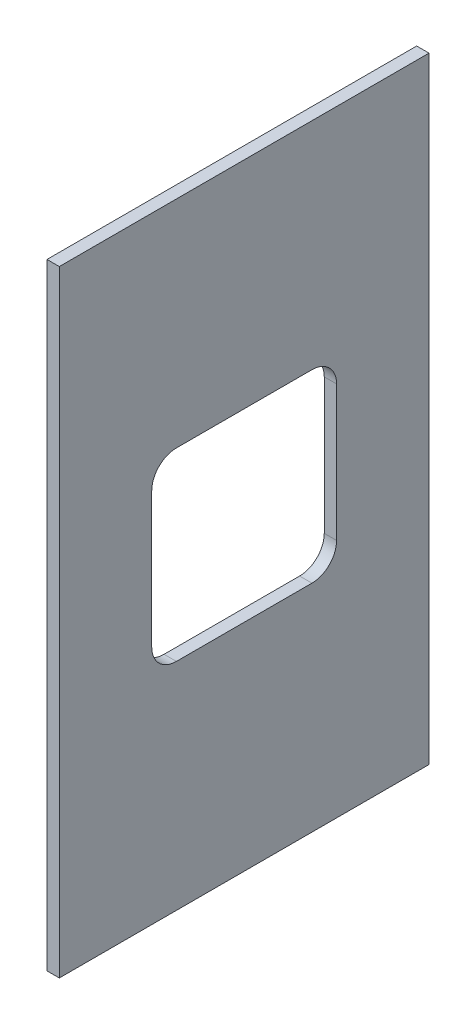
ISO-10303-21;
HEADER;
FILE_DESCRIPTION(('STEP AP214'),'2;1');
FILE_NAME('part.step','',(''),(''),'','','');
FILE_SCHEMA(('AUTOMOTIVE_DESIGN { 1 0 10303 214 1 1 1 1 }'));
ENDSEC;
DATA;
#1=APPLICATION_CONTEXT('core data for automotive mechanical design processes');
#2=APPLICATION_PROTOCOL_DEFINITION('international standard','automotive_design',2000,#1);
#3=PRODUCT_CONTEXT('',#1,'mechanical');
#4=PRODUCT('Part','Part','',(#3));
#5=PRODUCT_RELATED_PRODUCT_CATEGORY('part','',(#4));
#6=PRODUCT_DEFINITION_FORMATION('','',#4);
#7=PRODUCT_DEFINITION_CONTEXT('part definition',#1,'design');
#8=PRODUCT_DEFINITION('design','',#6,#7);
#9=PRODUCT_DEFINITION_SHAPE('','',#8);
#10=(LENGTH_UNIT() NAMED_UNIT(*) SI_UNIT(.MILLI.,.METRE.));
#11=(NAMED_UNIT(*) PLANE_ANGLE_UNIT() SI_UNIT($,.RADIAN.));
#12=(NAMED_UNIT(*) SI_UNIT($,.STERADIAN.) SOLID_ANGLE_UNIT());
#13=UNCERTAINTY_MEASURE_WITH_UNIT(LENGTH_MEASURE(1.E-05),#10,'distance_accuracy_value','');
#14=(GEOMETRIC_REPRESENTATION_CONTEXT(3) GLOBAL_UNCERTAINTY_ASSIGNED_CONTEXT((#13)) GLOBAL_UNIT_ASSIGNED_CONTEXT((#10,
#11,#12)) REPRESENTATION_CONTEXT('',''));
#15=CARTESIAN_POINT('',(0.,0.,0.));
#16=DIRECTION('',(0.,0.,1.));
#17=DIRECTION('',(1.,0.,0.));
#18=AXIS2_PLACEMENT_3D('',#15,#16,#17);
#19=CARTESIAN_POINT('',(10.,0.,0.));
#20=DIRECTION('',(-1.,0.,0.));
#21=DIRECTION('',(0.,0.,1.));
#22=AXIS2_PLACEMENT_3D('',#19,#20,#21);
#23=PLANE('',#22);
#24=DIRECTION('',(0.,0.,-1.));
#25=VECTOR('',#24,1.);
#26=CARTESIAN_POINT('',(10.,0.,0.));
#27=LINE('',#26,#25);
#28=CARTESIAN_POINT('',(10.,0.,300.));
#29=VERTEX_POINT('',#28);
#30=CARTESIAN_POINT('',(10.,0.,0.));
#31=VERTEX_POINT('',#30);
#32=EDGE_CURVE('E178',#29,#31,#27,.T.);
#33=ORIENTED_EDGE('',*,*,#32,.T.);
#34=DIRECTION('',(0.,1.,0.));
#35=VECTOR('',#34,1.);
#36=CARTESIAN_POINT('',(10.,0.,0.));
#37=LINE('',#36,#35);
#38=CARTESIAN_POINT('',(10.,500.,0.));
#39=VERTEX_POINT('',#38);
#40=EDGE_CURVE('E183',#31,#39,#37,.T.);
#41=ORIENTED_EDGE('',*,*,#40,.T.);
#42=DIRECTION('',(0.,0.,1.));
#43=VECTOR('',#42,1.);
#44=CARTESIAN_POINT('',(10.,500.,0.));
#45=LINE('',#44,#43);
#46=CARTESIAN_POINT('',(10.,500.,300.));
#47=VERTEX_POINT('',#46);
#48=EDGE_CURVE('E187',#39,#47,#45,.T.);
#49=ORIENTED_EDGE('',*,*,#48,.T.);
#50=DIRECTION('',(0.,-1.,0.));
#51=VECTOR('',#50,1.);
#52=CARTESIAN_POINT('',(10.,0.,300.));
#53=LINE('',#52,#51);
#54=EDGE_CURVE('E191',#47,#29,#53,.T.);
#55=ORIENTED_EDGE('',*,*,#54,.T.);
#56=EDGE_LOOP('',(#33,#41,#49,#55));
#57=FACE_BOUND('',#56,.T.);
#58=CARTESIAN_POINT('',(10.,305.,95.));
#59=DIRECTION('',(1.,0.,0.));
#60=DIRECTION('',(0.,0.,-1.));
#61=AXIS2_PLACEMENT_3D('',#58,#59,#60);
#62=CIRCLE('',#61,20.);
#63=CARTESIAN_POINT('',(10.,305.,75.));
#64=VERTEX_POINT('',#63);
#65=CARTESIAN_POINT('',(10.,325.,95.0000000000002));
#66=VERTEX_POINT('',#65);
#67=EDGE_CURVE('E138',#64,#66,#62,.T.);
#68=ORIENTED_EDGE('',*,*,#67,.F.);
#69=DIRECTION('',(0.,1.,0.));
#70=VECTOR('',#69,1.);
#71=CARTESIAN_POINT('',(10.,195.,75.));
#72=LINE('',#71,#70);
#73=CARTESIAN_POINT('',(10.,195.,75.));
#74=VERTEX_POINT('',#73);
#75=EDGE_CURVE('E311',#74,#64,#72,.T.);
#76=ORIENTED_EDGE('',*,*,#75,.F.);
#77=CARTESIAN_POINT('',(10.,195.,95.));
#78=DIRECTION('',(1.,0.,0.));
#79=DIRECTION('',(0.,0.,1.));
#80=AXIS2_PLACEMENT_3D('',#77,#78,#79);
#81=CIRCLE('',#80,20.);
#82=CARTESIAN_POINT('',(10.,175.,95.0000000000002));
#83=VERTEX_POINT('',#82);
#84=EDGE_CURVE('E351',#83,#74,#81,.T.);
#85=ORIENTED_EDGE('',*,*,#84,.F.);
#86=DIRECTION('',(0.,0.,-1.));
#87=VECTOR('',#86,1.);
#88=CARTESIAN_POINT('',(10.,175.,95.0000000000002));
#89=LINE('',#88,#87);
#90=CARTESIAN_POINT('',(10.,175.,205.));
#91=VERTEX_POINT('',#90);
#92=EDGE_CURVE('E349',#91,#83,#89,.T.);
#93=ORIENTED_EDGE('',*,*,#92,.F.);
#94=CARTESIAN_POINT('',(10.,195.,205.));
#95=DIRECTION('',(1.,0.,0.));
#96=DIRECTION('',(0.,0.,1.));
#97=AXIS2_PLACEMENT_3D('',#94,#95,#96);
#98=CIRCLE('',#97,20.);
#99=CARTESIAN_POINT('',(10.,195.,225.));
#100=VERTEX_POINT('',#99);
#101=EDGE_CURVE('E347',#100,#91,#98,.T.);
#102=ORIENTED_EDGE('',*,*,#101,.F.);
#103=DIRECTION('',(0.,-1.,0.));
#104=VECTOR('',#103,1.);
#105=CARTESIAN_POINT('',(10.,195.,225.));
#106=LINE('',#105,#104);
#107=CARTESIAN_POINT('',(10.,305.,225.));
#108=VERTEX_POINT('',#107);
#109=EDGE_CURVE('E165',#108,#100,#106,.T.);
#110=ORIENTED_EDGE('',*,*,#109,.F.);
#111=CARTESIAN_POINT('',(10.,305.,205.));
#112=DIRECTION('',(1.,0.,0.));
#113=DIRECTION('',(0.,0.,1.));
#114=AXIS2_PLACEMENT_3D('',#111,#112,#113);
#115=CIRCLE('',#114,20.);
#116=CARTESIAN_POINT('',(10.,325.,205.));
#117=VERTEX_POINT('',#116);
#118=EDGE_CURVE('E161',#117,#108,#115,.T.);
#119=ORIENTED_EDGE('',*,*,#118,.F.);
#120=DIRECTION('',(0.,0.,1.));
#121=VECTOR('',#120,1.);
#122=CARTESIAN_POINT('',(10.,325.,95.0000000000002));
#123=LINE('',#122,#121);
#124=EDGE_CURVE('E147',#66,#117,#123,.T.);
#125=ORIENTED_EDGE('',*,*,#124,.F.);
#126=EDGE_LOOP('',(#68,#76,#85,#93,#102,#110,#119,#125));
#127=FACE_BOUND('',#126,.T.);
#128=ADVANCED_FACE('F48',(#57,#127),#23,.F.);
#129=CARTESIAN_POINT('',(0.,0.,0.));
#130=DIRECTION('',(-1.,0.,0.));
#131=DIRECTION('',(0.,0.,1.));
#132=AXIS2_PLACEMENT_3D('',#129,#130,#131);
#133=PLANE('',#132);
#134=DIRECTION('',(0.,0.,-1.));
#135=VECTOR('',#134,1.);
#136=CARTESIAN_POINT('',(0.,0.,0.));
#137=LINE('',#136,#135);
#138=CARTESIAN_POINT('',(0.,0.,300.));
#139=VERTEX_POINT('',#138);
#140=CARTESIAN_POINT('',(0.,0.,0.));
#141=VERTEX_POINT('',#140);
#142=EDGE_CURVE('E156',#139,#141,#137,.T.);
#143=ORIENTED_EDGE('',*,*,#142,.F.);
#144=DIRECTION('',(0.,-1.,0.));
#145=VECTOR('',#144,1.);
#146=CARTESIAN_POINT('',(0.,0.,300.));
#147=LINE('',#146,#145);
#148=CARTESIAN_POINT('',(0.,500.,300.));
#149=VERTEX_POINT('',#148);
#150=EDGE_CURVE('E184',#149,#139,#147,.T.);
#151=ORIENTED_EDGE('',*,*,#150,.F.);
#152=DIRECTION('',(0.,0.,1.));
#153=VECTOR('',#152,1.);
#154=CARTESIAN_POINT('',(0.,500.,0.));
#155=LINE('',#154,#153);
#156=CARTESIAN_POINT('',(0.,500.,0.));
#157=VERTEX_POINT('',#156);
#158=EDGE_CURVE('E206',#157,#149,#155,.T.);
#159=ORIENTED_EDGE('',*,*,#158,.F.);
#160=DIRECTION('',(0.,1.,0.));
#161=VECTOR('',#160,1.);
#162=CARTESIAN_POINT('',(0.,0.,0.));
#163=LINE('',#162,#161);
#164=EDGE_CURVE('E229',#141,#157,#163,.T.);
#165=ORIENTED_EDGE('',*,*,#164,.F.);
#166=EDGE_LOOP('',(#143,#151,#159,#165));
#167=FACE_BOUND('',#166,.T.);
#168=DIRECTION('',(0.,1.,0.));
#169=VECTOR('',#168,1.);
#170=CARTESIAN_POINT('',(0.,195.,75.));
#171=LINE('',#170,#169);
#172=CARTESIAN_POINT('',(0.,195.,75.));
#173=VERTEX_POINT('',#172);
#174=CARTESIAN_POINT('',(0.,305.,75.));
#175=VERTEX_POINT('',#174);
#176=EDGE_CURVE('E148',#173,#175,#171,.T.);
#177=ORIENTED_EDGE('',*,*,#176,.T.);
#178=CARTESIAN_POINT('',(0.,305.,95.));
#179=DIRECTION('',(1.,0.,0.));
#180=DIRECTION('',(0.,0.,-1.));
#181=AXIS2_PLACEMENT_3D('',#178,#179,#180);
#182=CIRCLE('',#181,20.);
#183=CARTESIAN_POINT('',(0.,325.,95.0000000000002));
#184=VERTEX_POINT('',#183);
#185=EDGE_CURVE('E72',#175,#184,#182,.T.);
#186=ORIENTED_EDGE('',*,*,#185,.T.);
#187=DIRECTION('',(0.,0.,1.));
#188=VECTOR('',#187,1.);
#189=CARTESIAN_POINT('',(0.,325.,95.0000000000002));
#190=LINE('',#189,#188);
#191=CARTESIAN_POINT('',(0.,325.,205.));
#192=VERTEX_POINT('',#191);
#193=EDGE_CURVE('E154',#184,#192,#190,.T.);
#194=ORIENTED_EDGE('',*,*,#193,.T.);
#195=CARTESIAN_POINT('',(0.,305.,205.));
#196=DIRECTION('',(1.,0.,0.));
#197=DIRECTION('',(0.,0.,1.));
#198=AXIS2_PLACEMENT_3D('',#195,#196,#197);
#199=CIRCLE('',#198,20.);
#200=CARTESIAN_POINT('',(0.,305.,225.));
#201=VERTEX_POINT('',#200);
#202=EDGE_CURVE('E328',#192,#201,#199,.T.);
#203=ORIENTED_EDGE('',*,*,#202,.T.);
#204=DIRECTION('',(0.,-1.,0.));
#205=VECTOR('',#204,1.);
#206=CARTESIAN_POINT('',(0.,195.,225.));
#207=LINE('',#206,#205);
#208=CARTESIAN_POINT('',(0.,195.,225.));
#209=VERTEX_POINT('',#208);
#210=EDGE_CURVE('E333',#201,#209,#207,.T.);
#211=ORIENTED_EDGE('',*,*,#210,.T.);
#212=CARTESIAN_POINT('',(0.,195.,205.));
#213=DIRECTION('',(1.,0.,0.));
#214=DIRECTION('',(0.,0.,1.));
#215=AXIS2_PLACEMENT_3D('',#212,#213,#214);
#216=CIRCLE('',#215,20.);
#217=CARTESIAN_POINT('',(0.,175.,205.));
#218=VERTEX_POINT('',#217);
#219=EDGE_CURVE('E305',#209,#218,#216,.T.);
#220=ORIENTED_EDGE('',*,*,#219,.T.);
#221=DIRECTION('',(0.,0.,-1.));
#222=VECTOR('',#221,1.);
#223=CARTESIAN_POINT('',(0.,175.,95.0000000000002));
#224=LINE('',#223,#222);
#225=CARTESIAN_POINT('',(0.,175.,95.0000000000002));
#226=VERTEX_POINT('',#225);
#227=EDGE_CURVE('E300',#218,#226,#224,.T.);
#228=ORIENTED_EDGE('',*,*,#227,.T.);
#229=CARTESIAN_POINT('',(0.,195.,95.));
#230=DIRECTION('',(1.,0.,0.));
#231=DIRECTION('',(0.,0.,1.));
#232=AXIS2_PLACEMENT_3D('',#229,#230,#231);
#233=CIRCLE('',#232,20.);
#234=EDGE_CURVE('E294',#226,#173,#233,.T.);
#235=ORIENTED_EDGE('',*,*,#234,.T.);
#236=EDGE_LOOP('',(#177,#186,#194,#203,#211,#220,#228,#235));
#237=FACE_BOUND('',#236,.T.);
#238=ADVANCED_FACE('F227',(#167,#237),#133,.T.);
#239=CARTESIAN_POINT('',(10.,0.,0.));
#240=DIRECTION('',(0.,1.,0.));
#241=DIRECTION('',(0.,0.,1.));
#242=AXIS2_PLACEMENT_3D('',#239,#240,#241);
#243=PLANE('',#242);
#244=ORIENTED_EDGE('',*,*,#142,.T.);
#245=DIRECTION('',(-1.,0.,0.));
#246=VECTOR('',#245,1.);
#247=CARTESIAN_POINT('',(10.,0.,0.));
#248=LINE('',#247,#246);
#249=EDGE_CURVE('E12',#31,#141,#248,.T.);
#250=ORIENTED_EDGE('',*,*,#249,.F.);
#251=ORIENTED_EDGE('',*,*,#32,.F.);
#252=DIRECTION('',(-1.,0.,0.));
#253=VECTOR('',#252,1.);
#254=CARTESIAN_POINT('',(10.,0.,300.));
#255=LINE('',#254,#253);
#256=EDGE_CURVE('E194',#29,#139,#255,.T.);
#257=ORIENTED_EDGE('',*,*,#256,.T.);
#258=EDGE_LOOP('',(#244,#250,#251,#257));
#259=FACE_BOUND('',#258,.T.);
#260=ADVANCED_FACE('F50',(#259),#243,.F.);
#261=CARTESIAN_POINT('',(10.,0.,0.));
#262=DIRECTION('',(0.,0.,1.));
#263=DIRECTION('',(1.,0.,0.));
#264=AXIS2_PLACEMENT_3D('',#261,#262,#263);
#265=PLANE('',#264);
#266=ORIENTED_EDGE('',*,*,#164,.T.);
#267=DIRECTION('',(-1.,0.,0.));
#268=VECTOR('',#267,1.);
#269=CARTESIAN_POINT('',(10.,500.,0.));
#270=LINE('',#269,#268);
#271=EDGE_CURVE('E57',#39,#157,#270,.T.);
#272=ORIENTED_EDGE('',*,*,#271,.F.);
#273=ORIENTED_EDGE('',*,*,#40,.F.);
#274=ORIENTED_EDGE('',*,*,#249,.T.);
#275=EDGE_LOOP('',(#266,#272,#273,#274));
#276=FACE_BOUND('',#275,.T.);
#277=ADVANCED_FACE('F242',(#276),#265,.F.);
#278=CARTESIAN_POINT('',(10.,500.,0.));
#279=DIRECTION('',(0.,-1.,0.));
#280=DIRECTION('',(0.,0.,-1.));
#281=AXIS2_PLACEMENT_3D('',#278,#279,#280);
#282=PLANE('',#281);
#283=ORIENTED_EDGE('',*,*,#158,.T.);
#284=DIRECTION('',(-1.,0.,0.));
#285=VECTOR('',#284,1.);
#286=CARTESIAN_POINT('',(10.,500.,300.));
#287=LINE('',#286,#285);
#288=EDGE_CURVE('E211',#47,#149,#287,.T.);
#289=ORIENTED_EDGE('',*,*,#288,.F.);
#290=ORIENTED_EDGE('',*,*,#48,.F.);
#291=ORIENTED_EDGE('',*,*,#271,.T.);
#292=EDGE_LOOP('',(#283,#289,#290,#291));
#293=FACE_BOUND('',#292,.T.);
#294=ADVANCED_FACE('F221',(#293),#282,.F.);
#295=CARTESIAN_POINT('',(10.,0.,300.));
#296=DIRECTION('',(0.,0.,-1.));
#297=DIRECTION('',(-1.,0.,0.));
#298=AXIS2_PLACEMENT_3D('',#295,#296,#297);
#299=PLANE('',#298);
#300=ORIENTED_EDGE('',*,*,#150,.T.);
#301=ORIENTED_EDGE('',*,*,#256,.F.);
#302=ORIENTED_EDGE('',*,*,#54,.F.);
#303=ORIENTED_EDGE('',*,*,#288,.T.);
#304=EDGE_LOOP('',(#300,#301,#302,#303));
#305=FACE_BOUND('',#304,.T.);
#306=ADVANCED_FACE('F240',(#305),#299,.F.);
#307=CARTESIAN_POINT('',(10.,305.,95.));
#308=DIRECTION('',(-1.,0.,0.));
#309=DIRECTION('',(0.,0.,1.));
#310=AXIS2_PLACEMENT_3D('',#307,#308,#309);
#311=CYLINDRICAL_SURFACE('',#310,20.);
#312=ORIENTED_EDGE('',*,*,#185,.F.);
#313=DIRECTION('',(-1.,0.,0.));
#314=VECTOR('',#313,1.);
#315=CARTESIAN_POINT('',(10.,305.,75.));
#316=LINE('',#315,#314);
#317=EDGE_CURVE('E142',#64,#175,#316,.T.);
#318=ORIENTED_EDGE('',*,*,#317,.F.);
#319=ORIENTED_EDGE('',*,*,#67,.T.);
#320=DIRECTION('',(-1.,0.,0.));
#321=VECTOR('',#320,1.);
#322=CARTESIAN_POINT('',(10.,325.,95.0000000000002));
#323=LINE('',#322,#321);
#324=EDGE_CURVE('E141',#66,#184,#323,.T.);
#325=ORIENTED_EDGE('',*,*,#324,.T.);
#326=EDGE_LOOP('',(#312,#318,#319,#325));
#327=FACE_BOUND('',#326,.T.);
#328=ADVANCED_FACE('F140',(#327),#311,.F.);
#329=CARTESIAN_POINT('',(10.,325.,95.0000000000002));
#330=DIRECTION('',(0.,-1.,0.));
#331=DIRECTION('',(0.,0.,-1.));
#332=AXIS2_PLACEMENT_3D('',#329,#330,#331);
#333=PLANE('',#332);
#334=ORIENTED_EDGE('',*,*,#193,.F.);
#335=ORIENTED_EDGE('',*,*,#324,.F.);
#336=ORIENTED_EDGE('',*,*,#124,.T.);
#337=DIRECTION('',(-1.,0.,0.));
#338=VECTOR('',#337,1.);
#339=CARTESIAN_POINT('',(10.,325.,205.));
#340=LINE('',#339,#338);
#341=EDGE_CURVE('E157',#117,#192,#340,.T.);
#342=ORIENTED_EDGE('',*,*,#341,.T.);
#343=EDGE_LOOP('',(#334,#335,#336,#342));
#344=FACE_BOUND('',#343,.T.);
#345=ADVANCED_FACE('F151',(#344),#333,.T.);
#346=CARTESIAN_POINT('',(10.,305.,205.));
#347=DIRECTION('',(-1.,0.,0.));
#348=DIRECTION('',(0.,0.,1.));
#349=AXIS2_PLACEMENT_3D('',#346,#347,#348);
#350=CYLINDRICAL_SURFACE('',#349,20.);
#351=ORIENTED_EDGE('',*,*,#202,.F.);
#352=ORIENTED_EDGE('',*,*,#341,.F.);
#353=ORIENTED_EDGE('',*,*,#118,.T.);
#354=DIRECTION('',(-1.,0.,0.));
#355=VECTOR('',#354,1.);
#356=CARTESIAN_POINT('',(10.,305.,225.));
#357=LINE('',#356,#355);
#358=EDGE_CURVE('E323',#108,#201,#357,.T.);
#359=ORIENTED_EDGE('',*,*,#358,.T.);
#360=EDGE_LOOP('',(#351,#352,#353,#359));
#361=FACE_BOUND('',#360,.T.);
#362=ADVANCED_FACE('F268',(#361),#350,.F.);
#363=CARTESIAN_POINT('',(10.,195.,225.));
#364=DIRECTION('',(0.,0.,-1.));
#365=DIRECTION('',(0.,1.,0.));
#366=AXIS2_PLACEMENT_3D('',#363,#364,#365);
#367=PLANE('',#366);
#368=ORIENTED_EDGE('',*,*,#210,.F.);
#369=ORIENTED_EDGE('',*,*,#358,.F.);
#370=ORIENTED_EDGE('',*,*,#109,.T.);
#371=DIRECTION('',(-1.,0.,0.));
#372=VECTOR('',#371,1.);
#373=CARTESIAN_POINT('',(10.,195.,225.));
#374=LINE('',#373,#372);
#375=EDGE_CURVE('E320',#100,#209,#374,.T.);
#376=ORIENTED_EDGE('',*,*,#375,.T.);
#377=EDGE_LOOP('',(#368,#369,#370,#376));
#378=FACE_BOUND('',#377,.T.);
#379=ADVANCED_FACE('F270',(#378),#367,.T.);
#380=CARTESIAN_POINT('',(10.,195.,205.));
#381=DIRECTION('',(-1.,0.,0.));
#382=DIRECTION('',(0.,0.,1.));
#383=AXIS2_PLACEMENT_3D('',#380,#381,#382);
#384=CYLINDRICAL_SURFACE('',#383,20.);
#385=ORIENTED_EDGE('',*,*,#219,.F.);
#386=ORIENTED_EDGE('',*,*,#375,.F.);
#387=ORIENTED_EDGE('',*,*,#101,.T.);
#388=DIRECTION('',(-1.,0.,0.));
#389=VECTOR('',#388,1.);
#390=CARTESIAN_POINT('',(10.,175.,205.));
#391=LINE('',#390,#389);
#392=EDGE_CURVE('E317',#91,#218,#391,.T.);
#393=ORIENTED_EDGE('',*,*,#392,.T.);
#394=EDGE_LOOP('',(#385,#386,#387,#393));
#395=FACE_BOUND('',#394,.T.);
#396=ADVANCED_FACE('F275',(#395),#384,.F.);
#397=CARTESIAN_POINT('',(10.,175.,95.0000000000002));
#398=DIRECTION('',(0.,1.,0.));
#399=DIRECTION('',(0.,0.,1.));
#400=AXIS2_PLACEMENT_3D('',#397,#398,#399);
#401=PLANE('',#400);
#402=ORIENTED_EDGE('',*,*,#227,.F.);
#403=ORIENTED_EDGE('',*,*,#392,.F.);
#404=ORIENTED_EDGE('',*,*,#92,.T.);
#405=DIRECTION('',(-1.,0.,0.));
#406=VECTOR('',#405,1.);
#407=CARTESIAN_POINT('',(10.,175.,95.0000000000002));
#408=LINE('',#407,#406);
#409=EDGE_CURVE('E314',#83,#226,#408,.T.);
#410=ORIENTED_EDGE('',*,*,#409,.T.);
#411=EDGE_LOOP('',(#402,#403,#404,#410));
#412=FACE_BOUND('',#411,.T.);
#413=ADVANCED_FACE('F279',(#412),#401,.T.);
#414=CARTESIAN_POINT('',(10.,195.,95.));
#415=DIRECTION('',(-1.,0.,0.));
#416=DIRECTION('',(0.,0.,1.));
#417=AXIS2_PLACEMENT_3D('',#414,#415,#416);
#418=CYLINDRICAL_SURFACE('',#417,20.);
#419=ORIENTED_EDGE('',*,*,#234,.F.);
#420=ORIENTED_EDGE('',*,*,#409,.F.);
#421=ORIENTED_EDGE('',*,*,#84,.T.);
#422=DIRECTION('',(-1.,0.,0.));
#423=VECTOR('',#422,1.);
#424=CARTESIAN_POINT('',(10.,195.,75.));
#425=LINE('',#424,#423);
#426=EDGE_CURVE('E64',#74,#173,#425,.T.);
#427=ORIENTED_EDGE('',*,*,#426,.T.);
#428=EDGE_LOOP('',(#419,#420,#421,#427));
#429=FACE_BOUND('',#428,.T.);
#430=ADVANCED_FACE('F282',(#429),#418,.F.);
#431=CARTESIAN_POINT('',(10.,195.,75.));
#432=DIRECTION('',(0.,0.,1.));
#433=DIRECTION('',(1.,0.,0.));
#434=AXIS2_PLACEMENT_3D('',#431,#432,#433);
#435=PLANE('',#434);
#436=ORIENTED_EDGE('',*,*,#176,.F.);
#437=ORIENTED_EDGE('',*,*,#426,.F.);
#438=ORIENTED_EDGE('',*,*,#75,.T.);
#439=ORIENTED_EDGE('',*,*,#317,.T.);
#440=EDGE_LOOP('',(#436,#437,#438,#439));
#441=FACE_BOUND('',#440,.T.);
#442=ADVANCED_FACE('F286',(#441),#435,.T.);
#443=CLOSED_SHELL('',(#128,#238,#260,#277,#294,#306,#328,#345,#362,#379,#396,#413,#430,#442));
#444=MANIFOLD_SOLID_BREP('B2',#443);
#445=ADVANCED_BREP_SHAPE_REPRESENTATION('',(#18,#444),#14);
#446=SHAPE_DEFINITION_REPRESENTATION(#9,#445);
ENDSEC;
END-ISO-10303-21;
